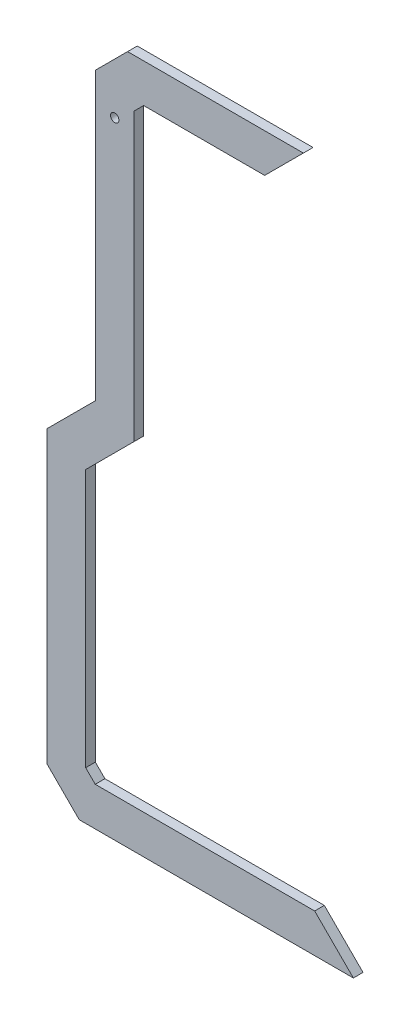
ISO-10303-21;
HEADER;
FILE_DESCRIPTION(('STEP AP214'),'2;1');
FILE_NAME('part.step','',(''),(''),'','','');
FILE_SCHEMA(('AUTOMOTIVE_DESIGN { 1 0 10303 214 1 1 1 1 }'));
ENDSEC;
DATA;
#1=APPLICATION_CONTEXT('core data for automotive mechanical design processes');
#2=APPLICATION_PROTOCOL_DEFINITION('international standard','automotive_design',2000,#1);
#3=PRODUCT_CONTEXT('',#1,'mechanical');
#4=PRODUCT('Part','Part','',(#3));
#5=PRODUCT_RELATED_PRODUCT_CATEGORY('part','',(#4));
#6=PRODUCT_DEFINITION_FORMATION('','',#4);
#7=PRODUCT_DEFINITION_CONTEXT('part definition',#1,'design');
#8=PRODUCT_DEFINITION('design','',#6,#7);
#9=PRODUCT_DEFINITION_SHAPE('','',#8);
#10=(LENGTH_UNIT() NAMED_UNIT(*) SI_UNIT(.MILLI.,.METRE.));
#11=(NAMED_UNIT(*) PLANE_ANGLE_UNIT() SI_UNIT($,.RADIAN.));
#12=(NAMED_UNIT(*) SI_UNIT($,.STERADIAN.) SOLID_ANGLE_UNIT());
#13=UNCERTAINTY_MEASURE_WITH_UNIT(LENGTH_MEASURE(1.E-05),#10,'distance_accuracy_value','');
#14=(GEOMETRIC_REPRESENTATION_CONTEXT(3) GLOBAL_UNCERTAINTY_ASSIGNED_CONTEXT((#13)) GLOBAL_UNIT_ASSIGNED_CONTEXT((#10,
#11,#12)) REPRESENTATION_CONTEXT('',''));
#15=CARTESIAN_POINT('',(0.,0.,0.));
#16=DIRECTION('',(0.,0.,1.));
#17=DIRECTION('',(1.,0.,0.));
#18=AXIS2_PLACEMENT_3D('',#15,#16,#17);
#19=CARTESIAN_POINT('',(0.,0.,3.));
#20=DIRECTION('',(0.,0.,1.));
#21=DIRECTION('',(1.,0.,0.));
#22=AXIS2_PLACEMENT_3D('',#19,#20,#21);
#23=PLANE('',#22);
#24=DIRECTION('',(-0.707106781186551,0.707106781186544,0.));
#25=VECTOR('',#24,1.);
#26=CARTESIAN_POINT('',(58.0000000000498,-167.75395984717,3.));
#27=LINE('',#26,#25);
#28=CARTESIAN_POINT('',(70.00000000005,-179.75395984717,3.));
#29=VERTEX_POINT('',#28);
#30=CARTESIAN_POINT('',(58.0000000000498,-167.75395984717,3.));
#31=VERTEX_POINT('',#30);
#32=EDGE_CURVE('E209',#29,#31,#27,.T.);
#33=ORIENTED_EDGE('',*,*,#32,.T.);
#34=DIRECTION('',(-1.,0.,0.));
#35=VECTOR('',#34,1.);
#36=CARTESIAN_POINT('',(-10.0294372514729,-167.75395984717,3.));
#37=LINE('',#36,#35);
#38=CARTESIAN_POINT('',(-10.0294372514729,-167.75395984717,3.));
#39=VERTEX_POINT('',#38);
#40=EDGE_CURVE('E117',#31,#39,#37,.T.);
#41=ORIENTED_EDGE('',*,*,#40,.T.);
#42=DIRECTION('',(-0.707106781186547,0.707106781186548,0.));
#43=VECTOR('',#42,1.);
#44=CARTESIAN_POINT('',(-12.9999999999501,-164.783397098693,3.));
#45=LINE('',#44,#43);
#46=CARTESIAN_POINT('',(-12.9999999999501,-164.783397098693,3.));
#47=VERTEX_POINT('',#46);
#48=EDGE_CURVE('E248',#39,#47,#45,.T.);
#49=ORIENTED_EDGE('',*,*,#48,.T.);
#50=DIRECTION('',(0.,1.,0.));
#51=VECTOR('',#50,1.);
#52=CARTESIAN_POINT('',(-12.9999999999501,-84.724522595647,3.));
#53=LINE('',#52,#51);
#54=CARTESIAN_POINT('',(-12.9999999999501,-84.724522595647,3.));
#55=VERTEX_POINT('',#54);
#56=EDGE_CURVE('E267',#47,#55,#53,.T.);
#57=ORIENTED_EDGE('',*,*,#56,.T.);
#58=DIRECTION('',(0.707106781186548,0.707106781186547,0.));
#59=VECTOR('',#58,1.);
#60=CARTESIAN_POINT('',(2.00000000004993,-69.724522595647,3.));
#61=LINE('',#60,#59);
#62=CARTESIAN_POINT('',(2.00000000004993,-69.724522595647,3.));
#63=VERTEX_POINT('',#62);
#64=EDGE_CURVE('E264',#55,#63,#61,.T.);
#65=ORIENTED_EDGE('',*,*,#64,.T.);
#66=DIRECTION('',(0.,1.,0.));
#67=VECTOR('',#66,1.);
#68=CARTESIAN_POINT('',(2.0000000000499,19.0329830325361,3.));
#69=LINE('',#68,#67);
#70=CARTESIAN_POINT('',(2.0000000000499,19.0329830325361,3.));
#71=VERTEX_POINT('',#70);
#72=EDGE_CURVE('E266',#63,#71,#69,.T.);
#73=ORIENTED_EDGE('',*,*,#72,.T.);
#74=DIRECTION('',(0.707106781186547,0.707106781186548,0.));
#75=VECTOR('',#74,1.);
#76=CARTESIAN_POINT('',(4.97056274852707,22.0035457810133,3.));
#77=LINE('',#76,#75);
#78=CARTESIAN_POINT('',(4.97056274852707,22.0035457810133,3.));
#79=VERTEX_POINT('',#78);
#80=EDGE_CURVE('E269',#71,#79,#77,.T.);
#81=ORIENTED_EDGE('',*,*,#80,.T.);
#82=DIRECTION('',(1.,0.,0.));
#83=VECTOR('',#82,1.);
#84=CARTESIAN_POINT('',(42.5000000000001,22.0035457810132,3.));
#85=LINE('',#84,#83);
#86=CARTESIAN_POINT('',(42.5000000000001,22.0035457810132,3.));
#87=VERTEX_POINT('',#86);
#88=EDGE_CURVE('E275',#79,#87,#85,.T.);
#89=ORIENTED_EDGE('',*,*,#88,.T.);
#90=DIRECTION('',(0.707106781186546,0.707106781186549,0.));
#91=VECTOR('',#90,1.);
#92=CARTESIAN_POINT('',(54.5000000000001,34.0035457810133,3.));
#93=LINE('',#92,#91);
#94=CARTESIAN_POINT('',(54.5000000000001,34.0035457810133,3.));
#95=VERTEX_POINT('',#94);
#96=EDGE_CURVE('E277',#87,#95,#93,.T.);
#97=ORIENTED_EDGE('',*,*,#96,.T.);
#98=DIRECTION('',(-1.,0.,0.));
#99=VECTOR('',#98,1.);
#100=CARTESIAN_POINT('',(4.99372209757684E-11,34.0035457810133,3.));
#101=LINE('',#100,#99);
#102=CARTESIAN_POINT('',(4.99372209757684E-11,34.0035457810133,3.));
#103=VERTEX_POINT('',#102);
#104=EDGE_CURVE('E279',#95,#103,#101,.T.);
#105=ORIENTED_EDGE('',*,*,#104,.T.);
#106=DIRECTION('',(-0.707106781186548,-0.707106781186548,0.));
#107=VECTOR('',#106,1.);
#108=CARTESIAN_POINT('',(-9.99999999995007,24.0035457810133,3.));
#109=LINE('',#108,#107);
#110=CARTESIAN_POINT('',(-9.99999999995007,24.0035457810133,3.));
#111=VERTEX_POINT('',#110);
#112=EDGE_CURVE('E281',#103,#111,#109,.T.);
#113=ORIENTED_EDGE('',*,*,#112,.T.);
#114=DIRECTION('',(0.,-1.,0.));
#115=VECTOR('',#114,1.);
#116=CARTESIAN_POINT('',(-9.99999999995006,-64.7539598471697,3.));
#117=LINE('',#116,#115);
#118=CARTESIAN_POINT('',(-9.99999999995006,-64.7539598471697,3.));
#119=VERTEX_POINT('',#118);
#120=EDGE_CURVE('E283',#111,#119,#117,.T.);
#121=ORIENTED_EDGE('',*,*,#120,.T.);
#122=DIRECTION('',(-0.707106781186544,-0.707106781186551,0.));
#123=VECTOR('',#122,1.);
#124=CARTESIAN_POINT('',(-24.9999999999501,-79.7539598471698,3.));
#125=LINE('',#124,#123);
#126=CARTESIAN_POINT('',(-24.9999999999501,-79.7539598471698,3.));
#127=VERTEX_POINT('',#126);
#128=EDGE_CURVE('E160',#119,#127,#125,.T.);
#129=ORIENTED_EDGE('',*,*,#128,.T.);
#130=DIRECTION('',(0.,-1.,0.));
#131=VECTOR('',#130,1.);
#132=CARTESIAN_POINT('',(-24.9999999999501,-169.75395984717,3.));
#133=LINE('',#132,#131);
#134=CARTESIAN_POINT('',(-24.9999999999501,-169.75395984717,3.));
#135=VERTEX_POINT('',#134);
#136=EDGE_CURVE('E154',#127,#135,#133,.T.);
#137=ORIENTED_EDGE('',*,*,#136,.T.);
#138=DIRECTION('',(0.707106781186547,-0.707106781186548,0.));
#139=VECTOR('',#138,1.);
#140=CARTESIAN_POINT('',(-14.9999999999501,-179.75395984717,3.));
#141=LINE('',#140,#139);
#142=CARTESIAN_POINT('',(-14.9999999999501,-179.75395984717,3.));
#143=VERTEX_POINT('',#142);
#144=EDGE_CURVE('E158',#135,#143,#141,.T.);
#145=ORIENTED_EDGE('',*,*,#144,.T.);
#146=DIRECTION('',(1.,0.,0.));
#147=VECTOR('',#146,1.);
#148=CARTESIAN_POINT('',(70.00000000005,-179.75395984717,3.));
#149=LINE('',#148,#147);
#150=EDGE_CURVE('E50',#143,#29,#149,.T.);
#151=ORIENTED_EDGE('',*,*,#150,.T.);
#152=EDGE_LOOP('',(#33,#41,#49,#57,#65,#73,#81,#89,#97,#105,#113,#121,#129,#137,#145,#151));
#153=FACE_BOUND('',#152,.T.);
#154=CARTESIAN_POINT('',(-3.99999999995006,14.2435457810134,3.));
#155=DIRECTION('',(0.,0.,1.));
#156=DIRECTION('',(1.,0.,0.));
#157=AXIS2_PLACEMENT_3D('',#154,#155,#156);
#158=CIRCLE('',#157,1.3);
#159=CARTESIAN_POINT('',(-2.69999999995006,14.2435457810134,3.));
#160=VERTEX_POINT('',#159);
#161=EDGE_CURVE('E182',#160,#160,#158,.T.);
#162=ORIENTED_EDGE('',*,*,#161,.F.);
#163=EDGE_LOOP('',(#162));
#164=FACE_BOUND('',#163,.T.);
#165=ADVANCED_FACE('F33',(#153,#164),#23,.T.);
#166=CARTESIAN_POINT('',(0.,0.,0.));
#167=DIRECTION('',(0.,0.,1.));
#168=DIRECTION('',(1.,0.,0.));
#169=AXIS2_PLACEMENT_3D('',#166,#167,#168);
#170=PLANE('',#169);
#171=DIRECTION('',(-0.707106781186551,0.707106781186544,0.));
#172=VECTOR('',#171,1.);
#173=CARTESIAN_POINT('',(58.0000000000498,-167.75395984717,0.));
#174=LINE('',#173,#172);
#175=CARTESIAN_POINT('',(70.00000000005,-179.75395984717,0.));
#176=VERTEX_POINT('',#175);
#177=CARTESIAN_POINT('',(58.0000000000498,-167.75395984717,0.));
#178=VERTEX_POINT('',#177);
#179=EDGE_CURVE('E178',#176,#178,#174,.T.);
#180=ORIENTED_EDGE('',*,*,#179,.F.);
#181=DIRECTION('',(1.,0.,0.));
#182=VECTOR('',#181,1.);
#183=CARTESIAN_POINT('',(70.00000000005,-179.75395984717,0.));
#184=LINE('',#183,#182);
#185=CARTESIAN_POINT('',(-14.9999999999501,-179.75395984717,0.));
#186=VERTEX_POINT('',#185);
#187=EDGE_CURVE('E109',#186,#176,#184,.T.);
#188=ORIENTED_EDGE('',*,*,#187,.F.);
#189=DIRECTION('',(0.707106781186547,-0.707106781186548,0.));
#190=VECTOR('',#189,1.);
#191=CARTESIAN_POINT('',(-14.9999999999501,-179.75395984717,0.));
#192=LINE('',#191,#190);
#193=CARTESIAN_POINT('',(-24.9999999999501,-169.75395984717,0.));
#194=VERTEX_POINT('',#193);
#195=EDGE_CURVE('E103',#194,#186,#192,.T.);
#196=ORIENTED_EDGE('',*,*,#195,.F.);
#197=DIRECTION('',(0.,-1.,0.));
#198=VECTOR('',#197,1.);
#199=CARTESIAN_POINT('',(-24.9999999999501,-169.75395984717,0.));
#200=LINE('',#199,#198);
#201=CARTESIAN_POINT('',(-24.9999999999501,-79.7539598471698,0.));
#202=VERTEX_POINT('',#201);
#203=EDGE_CURVE('E168',#202,#194,#200,.T.);
#204=ORIENTED_EDGE('',*,*,#203,.F.);
#205=DIRECTION('',(-0.707106781186544,-0.707106781186551,0.));
#206=VECTOR('',#205,1.);
#207=CARTESIAN_POINT('',(-24.9999999999501,-79.7539598471698,0.));
#208=LINE('',#207,#206);
#209=CARTESIAN_POINT('',(-9.99999999995006,-64.7539598471697,0.));
#210=VERTEX_POINT('',#209);
#211=EDGE_CURVE('E204',#210,#202,#208,.T.);
#212=ORIENTED_EDGE('',*,*,#211,.F.);
#213=DIRECTION('',(0.,-1.,0.));
#214=VECTOR('',#213,1.);
#215=CARTESIAN_POINT('',(-9.99999999995006,-64.7539598471697,0.));
#216=LINE('',#215,#214);
#217=CARTESIAN_POINT('',(-9.99999999995007,24.0035457810133,0.));
#218=VERTEX_POINT('',#217);
#219=EDGE_CURVE('E202',#218,#210,#216,.T.);
#220=ORIENTED_EDGE('',*,*,#219,.F.);
#221=DIRECTION('',(-0.707106781186548,-0.707106781186548,0.));
#222=VECTOR('',#221,1.);
#223=CARTESIAN_POINT('',(-9.99999999995007,24.0035457810133,0.));
#224=LINE('',#223,#222);
#225=CARTESIAN_POINT('',(4.99372209757684E-11,34.0035457810133,0.));
#226=VERTEX_POINT('',#225);
#227=EDGE_CURVE('E200',#226,#218,#224,.T.);
#228=ORIENTED_EDGE('',*,*,#227,.F.);
#229=DIRECTION('',(-1.,0.,0.));
#230=VECTOR('',#229,1.);
#231=CARTESIAN_POINT('',(4.99372209757684E-11,34.0035457810133,0.));
#232=LINE('',#231,#230);
#233=CARTESIAN_POINT('',(54.5000000000001,34.0035457810133,0.));
#234=VERTEX_POINT('',#233);
#235=EDGE_CURVE('E198',#234,#226,#232,.T.);
#236=ORIENTED_EDGE('',*,*,#235,.F.);
#237=DIRECTION('',(0.707106781186546,0.707106781186549,0.));
#238=VECTOR('',#237,1.);
#239=CARTESIAN_POINT('',(54.5000000000001,34.0035457810133,0.));
#240=LINE('',#239,#238);
#241=CARTESIAN_POINT('',(42.5000000000001,22.0035457810132,0.));
#242=VERTEX_POINT('',#241);
#243=EDGE_CURVE('E196',#242,#234,#240,.T.);
#244=ORIENTED_EDGE('',*,*,#243,.F.);
#245=DIRECTION('',(1.,0.,0.));
#246=VECTOR('',#245,1.);
#247=CARTESIAN_POINT('',(42.5000000000001,22.0035457810132,0.));
#248=LINE('',#247,#246);
#249=CARTESIAN_POINT('',(4.97056274852707,22.0035457810133,0.));
#250=VERTEX_POINT('',#249);
#251=EDGE_CURVE('E194',#250,#242,#248,.T.);
#252=ORIENTED_EDGE('',*,*,#251,.F.);
#253=DIRECTION('',(0.707106781186547,0.707106781186548,0.));
#254=VECTOR('',#253,1.);
#255=CARTESIAN_POINT('',(4.97056274852707,22.0035457810133,0.));
#256=LINE('',#255,#254);
#257=CARTESIAN_POINT('',(2.0000000000499,19.0329830325361,0.));
#258=VERTEX_POINT('',#257);
#259=EDGE_CURVE('E192',#258,#250,#256,.T.);
#260=ORIENTED_EDGE('',*,*,#259,.F.);
#261=DIRECTION('',(0.,1.,0.));
#262=VECTOR('',#261,1.);
#263=CARTESIAN_POINT('',(2.0000000000499,19.0329830325361,0.));
#264=LINE('',#263,#262);
#265=CARTESIAN_POINT('',(2.00000000004993,-69.724522595647,0.));
#266=VERTEX_POINT('',#265);
#267=EDGE_CURVE('E190',#266,#258,#264,.T.);
#268=ORIENTED_EDGE('',*,*,#267,.F.);
#269=DIRECTION('',(0.707106781186548,0.707106781186547,0.));
#270=VECTOR('',#269,1.);
#271=CARTESIAN_POINT('',(2.00000000004993,-69.724522595647,0.));
#272=LINE('',#271,#270);
#273=CARTESIAN_POINT('',(-12.9999999999501,-84.724522595647,0.));
#274=VERTEX_POINT('',#273);
#275=EDGE_CURVE('E188',#274,#266,#272,.T.);
#276=ORIENTED_EDGE('',*,*,#275,.F.);
#277=DIRECTION('',(0.,1.,0.));
#278=VECTOR('',#277,1.);
#279=CARTESIAN_POINT('',(-12.9999999999501,-84.724522595647,0.));
#280=LINE('',#279,#278);
#281=CARTESIAN_POINT('',(-12.9999999999501,-164.783397098693,0.));
#282=VERTEX_POINT('',#281);
#283=EDGE_CURVE('E186',#282,#274,#280,.T.);
#284=ORIENTED_EDGE('',*,*,#283,.F.);
#285=DIRECTION('',(-0.707106781186547,0.707106781186548,0.));
#286=VECTOR('',#285,1.);
#287=CARTESIAN_POINT('',(-12.9999999999501,-164.783397098693,0.));
#288=LINE('',#287,#286);
#289=CARTESIAN_POINT('',(-10.0294372514729,-167.75395984717,0.));
#290=VERTEX_POINT('',#289);
#291=EDGE_CURVE('E184',#290,#282,#288,.T.);
#292=ORIENTED_EDGE('',*,*,#291,.F.);
#293=DIRECTION('',(-1.,0.,0.));
#294=VECTOR('',#293,1.);
#295=CARTESIAN_POINT('',(-10.0294372514729,-167.75395984717,0.));
#296=LINE('',#295,#294);
#297=EDGE_CURVE('E181',#178,#290,#296,.T.);
#298=ORIENTED_EDGE('',*,*,#297,.F.);
#299=EDGE_LOOP('',(#180,#188,#196,#204,#212,#220,#228,#236,#244,#252,#260,#268,#276,#284,#292,#298));
#300=FACE_BOUND('',#299,.T.);
#301=CARTESIAN_POINT('',(-3.99999999995006,14.2435457810134,0.));
#302=DIRECTION('',(0.,0.,1.));
#303=DIRECTION('',(1.,0.,0.));
#304=AXIS2_PLACEMENT_3D('',#301,#302,#303);
#305=CIRCLE('',#304,1.3);
#306=CARTESIAN_POINT('',(-2.69999999995006,14.2435457810134,0.));
#307=VERTEX_POINT('',#306);
#308=EDGE_CURVE('E482',#307,#307,#305,.T.);
#309=ORIENTED_EDGE('',*,*,#308,.T.);
#310=EDGE_LOOP('',(#309));
#311=FACE_BOUND('',#310,.T.);
#312=ADVANCED_FACE('F252',(#300,#311),#170,.F.);
#313=CARTESIAN_POINT('',(58.0000000000498,-167.75395984717,3.));
#314=DIRECTION('',(-0.707106781186544,-0.707106781186551,0.));
#315=DIRECTION('',(0.707106781186551,-0.707106781186544,0.));
#316=AXIS2_PLACEMENT_3D('',#313,#314,#315);
#317=PLANE('',#316);
#318=ORIENTED_EDGE('',*,*,#179,.T.);
#319=DIRECTION('',(0.,0.,-1.));
#320=VECTOR('',#319,1.);
#321=CARTESIAN_POINT('',(58.0000000000498,-167.75395984717,3.));
#322=LINE('',#321,#320);
#323=EDGE_CURVE('E11',#31,#178,#322,.T.);
#324=ORIENTED_EDGE('',*,*,#323,.F.);
#325=ORIENTED_EDGE('',*,*,#32,.F.);
#326=DIRECTION('',(0.,0.,-1.));
#327=VECTOR('',#326,1.);
#328=CARTESIAN_POINT('',(70.00000000005,-179.75395984717,3.));
#329=LINE('',#328,#327);
#330=EDGE_CURVE('E174',#29,#176,#329,.T.);
#331=ORIENTED_EDGE('',*,*,#330,.T.);
#332=EDGE_LOOP('',(#318,#324,#325,#331));
#333=FACE_BOUND('',#332,.T.);
#334=ADVANCED_FACE('F35',(#333),#317,.F.);
#335=CARTESIAN_POINT('',(-10.0294372514729,-167.75395984717,3.));
#336=DIRECTION('',(0.,-1.,0.));
#337=DIRECTION('',(0.,0.,-1.));
#338=AXIS2_PLACEMENT_3D('',#335,#336,#337);
#339=PLANE('',#338);
#340=ORIENTED_EDGE('',*,*,#297,.T.);
#341=DIRECTION('',(0.,0.,-1.));
#342=VECTOR('',#341,1.);
#343=CARTESIAN_POINT('',(-10.0294372514729,-167.75395984717,3.));
#344=LINE('',#343,#342);
#345=EDGE_CURVE('E42',#39,#290,#344,.T.);
#346=ORIENTED_EDGE('',*,*,#345,.F.);
#347=ORIENTED_EDGE('',*,*,#40,.F.);
#348=ORIENTED_EDGE('',*,*,#323,.T.);
#349=EDGE_LOOP('',(#340,#346,#347,#348));
#350=FACE_BOUND('',#349,.T.);
#351=ADVANCED_FACE('F317',(#350),#339,.F.);
#352=CARTESIAN_POINT('',(-12.9999999999501,-164.783397098693,3.));
#353=DIRECTION('',(-0.707106781186548,-0.707106781186547,0.));
#354=DIRECTION('',(0.707106781186547,-0.707106781186548,0.));
#355=AXIS2_PLACEMENT_3D('',#352,#353,#354);
#356=PLANE('',#355);
#357=ORIENTED_EDGE('',*,*,#291,.T.);
#358=DIRECTION('',(0.,0.,-1.));
#359=VECTOR('',#358,1.);
#360=CARTESIAN_POINT('',(-12.9999999999501,-164.783397098693,3.));
#361=LINE('',#360,#359);
#362=EDGE_CURVE('E240',#47,#282,#361,.T.);
#363=ORIENTED_EDGE('',*,*,#362,.F.);
#364=ORIENTED_EDGE('',*,*,#48,.F.);
#365=ORIENTED_EDGE('',*,*,#345,.T.);
#366=EDGE_LOOP('',(#357,#363,#364,#365));
#367=FACE_BOUND('',#366,.T.);
#368=ADVANCED_FACE('F246',(#367),#356,.F.);
#369=CARTESIAN_POINT('',(-12.9999999999501,-84.724522595647,3.));
#370=DIRECTION('',(-1.,0.,0.));
#371=DIRECTION('',(0.,-1.,0.));
#372=AXIS2_PLACEMENT_3D('',#369,#370,#371);
#373=PLANE('',#372);
#374=ORIENTED_EDGE('',*,*,#283,.T.);
#375=DIRECTION('',(0.,0.,-1.));
#376=VECTOR('',#375,1.);
#377=CARTESIAN_POINT('',(-12.9999999999501,-84.724522595647,3.));
#378=LINE('',#377,#376);
#379=EDGE_CURVE('E237',#55,#274,#378,.T.);
#380=ORIENTED_EDGE('',*,*,#379,.F.);
#381=ORIENTED_EDGE('',*,*,#56,.F.);
#382=ORIENTED_EDGE('',*,*,#362,.T.);
#383=EDGE_LOOP('',(#374,#380,#381,#382));
#384=FACE_BOUND('',#383,.T.);
#385=ADVANCED_FACE('F258',(#384),#373,.F.);
#386=CARTESIAN_POINT('',(2.00000000004993,-69.724522595647,3.));
#387=DIRECTION('',(-0.707106781186547,0.707106781186548,0.));
#388=DIRECTION('',(-0.707106781186548,-0.707106781186547,0.));
#389=AXIS2_PLACEMENT_3D('',#386,#387,#388);
#390=PLANE('',#389);
#391=ORIENTED_EDGE('',*,*,#275,.T.);
#392=DIRECTION('',(0.,0.,-1.));
#393=VECTOR('',#392,1.);
#394=CARTESIAN_POINT('',(2.00000000004993,-69.724522595647,3.));
#395=LINE('',#394,#393);
#396=EDGE_CURVE('E234',#63,#266,#395,.T.);
#397=ORIENTED_EDGE('',*,*,#396,.F.);
#398=ORIENTED_EDGE('',*,*,#64,.F.);
#399=ORIENTED_EDGE('',*,*,#379,.T.);
#400=EDGE_LOOP('',(#391,#397,#398,#399));
#401=FACE_BOUND('',#400,.T.);
#402=ADVANCED_FACE('F262',(#401),#390,.F.);
#403=CARTESIAN_POINT('',(2.0000000000499,19.0329830325361,3.));
#404=DIRECTION('',(-1.,0.,0.));
#405=DIRECTION('',(0.,-1.,0.));
#406=AXIS2_PLACEMENT_3D('',#403,#404,#405);
#407=PLANE('',#406);
#408=ORIENTED_EDGE('',*,*,#267,.T.);
#409=DIRECTION('',(0.,0.,-1.));
#410=VECTOR('',#409,1.);
#411=CARTESIAN_POINT('',(2.0000000000499,19.0329830325361,3.));
#412=LINE('',#411,#410);
#413=EDGE_CURVE('E231',#71,#258,#412,.T.);
#414=ORIENTED_EDGE('',*,*,#413,.F.);
#415=ORIENTED_EDGE('',*,*,#72,.F.);
#416=ORIENTED_EDGE('',*,*,#396,.T.);
#417=EDGE_LOOP('',(#408,#414,#415,#416));
#418=FACE_BOUND('',#417,.T.);
#419=ADVANCED_FACE('F330',(#418),#407,.F.);
#420=CARTESIAN_POINT('',(4.97056274852707,22.0035457810133,3.));
#421=DIRECTION('',(-0.707106781186548,0.707106781186547,0.));
#422=DIRECTION('',(-0.707106781186547,-0.707106781186548,0.));
#423=AXIS2_PLACEMENT_3D('',#420,#421,#422);
#424=PLANE('',#423);
#425=ORIENTED_EDGE('',*,*,#259,.T.);
#426=DIRECTION('',(0.,0.,-1.));
#427=VECTOR('',#426,1.);
#428=CARTESIAN_POINT('',(4.97056274852707,22.0035457810133,3.));
#429=LINE('',#428,#427);
#430=EDGE_CURVE('E228',#79,#250,#429,.T.);
#431=ORIENTED_EDGE('',*,*,#430,.F.);
#432=ORIENTED_EDGE('',*,*,#80,.F.);
#433=ORIENTED_EDGE('',*,*,#413,.T.);
#434=EDGE_LOOP('',(#425,#431,#432,#433));
#435=FACE_BOUND('',#434,.T.);
#436=ADVANCED_FACE('F333',(#435),#424,.F.);
#437=CARTESIAN_POINT('',(42.5000000000001,22.0035457810132,3.));
#438=DIRECTION('',(0.,1.,0.));
#439=DIRECTION('',(-1.,0.,0.));
#440=AXIS2_PLACEMENT_3D('',#437,#438,#439);
#441=PLANE('',#440);
#442=ORIENTED_EDGE('',*,*,#251,.T.);
#443=DIRECTION('',(0.,0.,-1.));
#444=VECTOR('',#443,1.);
#445=CARTESIAN_POINT('',(42.5000000000001,22.0035457810132,3.));
#446=LINE('',#445,#444);
#447=EDGE_CURVE('E225',#87,#242,#446,.T.);
#448=ORIENTED_EDGE('',*,*,#447,.F.);
#449=ORIENTED_EDGE('',*,*,#88,.F.);
#450=ORIENTED_EDGE('',*,*,#430,.T.);
#451=EDGE_LOOP('',(#442,#448,#449,#450));
#452=FACE_BOUND('',#451,.T.);
#453=ADVANCED_FACE('F337',(#452),#441,.F.);
#454=CARTESIAN_POINT('',(54.5000000000001,34.0035457810133,3.));
#455=DIRECTION('',(-0.707106781186549,0.707106781186546,0.));
#456=DIRECTION('',(-0.707106781186546,-0.707106781186549,0.));
#457=AXIS2_PLACEMENT_3D('',#454,#455,#456);
#458=PLANE('',#457);
#459=ORIENTED_EDGE('',*,*,#243,.T.);
#460=DIRECTION('',(0.,0.,-1.));
#461=VECTOR('',#460,1.);
#462=CARTESIAN_POINT('',(54.5000000000001,34.0035457810133,3.));
#463=LINE('',#462,#461);
#464=EDGE_CURVE('E222',#95,#234,#463,.T.);
#465=ORIENTED_EDGE('',*,*,#464,.F.);
#466=ORIENTED_EDGE('',*,*,#96,.F.);
#467=ORIENTED_EDGE('',*,*,#447,.T.);
#468=EDGE_LOOP('',(#459,#465,#466,#467));
#469=FACE_BOUND('',#468,.T.);
#470=ADVANCED_FACE('F341',(#469),#458,.F.);
#471=CARTESIAN_POINT('',(4.99372209757684E-11,34.0035457810133,3.));
#472=DIRECTION('',(0.,-1.,0.));
#473=DIRECTION('',(0.,0.,-1.));
#474=AXIS2_PLACEMENT_3D('',#471,#472,#473);
#475=PLANE('',#474);
#476=ORIENTED_EDGE('',*,*,#235,.T.);
#477=DIRECTION('',(0.,0.,-1.));
#478=VECTOR('',#477,1.);
#479=CARTESIAN_POINT('',(4.99372209757684E-11,34.0035457810133,3.));
#480=LINE('',#479,#478);
#481=EDGE_CURVE('E219',#103,#226,#480,.T.);
#482=ORIENTED_EDGE('',*,*,#481,.F.);
#483=ORIENTED_EDGE('',*,*,#104,.F.);
#484=ORIENTED_EDGE('',*,*,#464,.T.);
#485=EDGE_LOOP('',(#476,#482,#483,#484));
#486=FACE_BOUND('',#485,.T.);
#487=ADVANCED_FACE('F345',(#486),#475,.F.);
#488=CARTESIAN_POINT('',(-9.99999999995007,24.0035457810133,3.));
#489=DIRECTION('',(0.707106781186547,-0.707106781186548,0.));
#490=DIRECTION('',(0.707106781186548,0.707106781186547,0.));
#491=AXIS2_PLACEMENT_3D('',#488,#489,#490);
#492=PLANE('',#491);
#493=ORIENTED_EDGE('',*,*,#227,.T.);
#494=DIRECTION('',(0.,0.,-1.));
#495=VECTOR('',#494,1.);
#496=CARTESIAN_POINT('',(-9.99999999995007,24.0035457810133,3.));
#497=LINE('',#496,#495);
#498=EDGE_CURVE('E216',#111,#218,#497,.T.);
#499=ORIENTED_EDGE('',*,*,#498,.F.);
#500=ORIENTED_EDGE('',*,*,#112,.F.);
#501=ORIENTED_EDGE('',*,*,#481,.T.);
#502=EDGE_LOOP('',(#493,#499,#500,#501));
#503=FACE_BOUND('',#502,.T.);
#504=ADVANCED_FACE('F349',(#503),#492,.F.);
#505=CARTESIAN_POINT('',(-9.99999999995006,-64.7539598471697,3.));
#506=DIRECTION('',(1.,0.,0.));
#507=DIRECTION('',(0.,1.,0.));
#508=AXIS2_PLACEMENT_3D('',#505,#506,#507);
#509=PLANE('',#508);
#510=ORIENTED_EDGE('',*,*,#219,.T.);
#511=DIRECTION('',(0.,0.,-1.));
#512=VECTOR('',#511,1.);
#513=CARTESIAN_POINT('',(-9.99999999995006,-64.7539598471697,3.));
#514=LINE('',#513,#512);
#515=EDGE_CURVE('E213',#119,#210,#514,.T.);
#516=ORIENTED_EDGE('',*,*,#515,.F.);
#517=ORIENTED_EDGE('',*,*,#120,.F.);
#518=ORIENTED_EDGE('',*,*,#498,.T.);
#519=EDGE_LOOP('',(#510,#516,#517,#518));
#520=FACE_BOUND('',#519,.T.);
#521=ADVANCED_FACE('F289',(#520),#509,.F.);
#522=CARTESIAN_POINT('',(-24.9999999999501,-79.7539598471698,3.));
#523=DIRECTION('',(0.707106781186551,-0.707106781186544,0.));
#524=DIRECTION('',(0.707106781186544,0.707106781186551,0.));
#525=AXIS2_PLACEMENT_3D('',#522,#523,#524);
#526=PLANE('',#525);
#527=ORIENTED_EDGE('',*,*,#211,.T.);
#528=DIRECTION('',(0.,0.,-1.));
#529=VECTOR('',#528,1.);
#530=CARTESIAN_POINT('',(-24.9999999999501,-79.7539598471698,3.));
#531=LINE('',#530,#529);
#532=EDGE_CURVE('E169',#127,#202,#531,.T.);
#533=ORIENTED_EDGE('',*,*,#532,.F.);
#534=ORIENTED_EDGE('',*,*,#128,.F.);
#535=ORIENTED_EDGE('',*,*,#515,.T.);
#536=EDGE_LOOP('',(#527,#533,#534,#535));
#537=FACE_BOUND('',#536,.T.);
#538=ADVANCED_FACE('F293',(#537),#526,.F.);
#539=CARTESIAN_POINT('',(-24.9999999999501,-169.75395984717,3.));
#540=DIRECTION('',(1.,0.,0.));
#541=DIRECTION('',(0.,1.,0.));
#542=AXIS2_PLACEMENT_3D('',#539,#540,#541);
#543=PLANE('',#542);
#544=ORIENTED_EDGE('',*,*,#203,.T.);
#545=DIRECTION('',(0.,0.,-1.));
#546=VECTOR('',#545,1.);
#547=CARTESIAN_POINT('',(-24.9999999999501,-169.75395984717,3.));
#548=LINE('',#547,#546);
#549=EDGE_CURVE('E165',#135,#194,#548,.T.);
#550=ORIENTED_EDGE('',*,*,#549,.F.);
#551=ORIENTED_EDGE('',*,*,#136,.F.);
#552=ORIENTED_EDGE('',*,*,#532,.T.);
#553=EDGE_LOOP('',(#544,#550,#551,#552));
#554=FACE_BOUND('',#553,.T.);
#555=ADVANCED_FACE('F166',(#554),#543,.F.);
#556=CARTESIAN_POINT('',(-14.9999999999501,-179.75395984717,3.));
#557=DIRECTION('',(0.707106781186548,0.707106781186547,0.));
#558=DIRECTION('',(-0.707106781186547,0.707106781186548,0.));
#559=AXIS2_PLACEMENT_3D('',#556,#557,#558);
#560=PLANE('',#559);
#561=ORIENTED_EDGE('',*,*,#195,.T.);
#562=DIRECTION('',(0.,0.,-1.));
#563=VECTOR('',#562,1.);
#564=CARTESIAN_POINT('',(-14.9999999999501,-179.75395984717,3.));
#565=LINE('',#564,#563);
#566=EDGE_CURVE('E170',#143,#186,#565,.T.);
#567=ORIENTED_EDGE('',*,*,#566,.F.);
#568=ORIENTED_EDGE('',*,*,#144,.F.);
#569=ORIENTED_EDGE('',*,*,#549,.T.);
#570=EDGE_LOOP('',(#561,#567,#568,#569));
#571=FACE_BOUND('',#570,.T.);
#572=ADVANCED_FACE('F172',(#571),#560,.F.);
#573=CARTESIAN_POINT('',(70.00000000005,-179.75395984717,3.));
#574=DIRECTION('',(0.,1.,0.));
#575=DIRECTION('',(0.,0.,1.));
#576=AXIS2_PLACEMENT_3D('',#573,#574,#575);
#577=PLANE('',#576);
#578=ORIENTED_EDGE('',*,*,#187,.T.);
#579=ORIENTED_EDGE('',*,*,#330,.F.);
#580=ORIENTED_EDGE('',*,*,#150,.F.);
#581=ORIENTED_EDGE('',*,*,#566,.T.);
#582=EDGE_LOOP('',(#578,#579,#580,#581));
#583=FACE_BOUND('',#582,.T.);
#584=ADVANCED_FACE('F297',(#583),#577,.F.);
#585=CARTESIAN_POINT('',(-3.99999999995006,14.2435457810134,3.));
#586=DIRECTION('',(0.,0.,-1.));
#587=DIRECTION('',(-1.,0.,0.));
#588=AXIS2_PLACEMENT_3D('',#585,#586,#587);
#589=CYLINDRICAL_SURFACE('',#588,1.3);
#590=ORIENTED_EDGE('',*,*,#161,.T.);
#591=EDGE_LOOP('',(#590));
#592=FACE_BOUND('',#591,.T.);
#593=ORIENTED_EDGE('',*,*,#308,.F.);
#594=EDGE_LOOP('',(#593));
#595=FACE_BOUND('',#594,.T.);
#596=ADVANCED_FACE('F299',(#592,#595),#589,.F.);
#597=CLOSED_SHELL('',(#165,#312,#334,#351,#368,#385,#402,#419,#436,#453,#470,#487,#504,#521,
#538,#555,#572,#584,#596));
#598=MANIFOLD_SOLID_BREP('B2',#597);
#599=ADVANCED_BREP_SHAPE_REPRESENTATION('',(#18,#598),#14);
#600=SHAPE_DEFINITION_REPRESENTATION(#9,#599);
ENDSEC;
END-ISO-10303-21;
